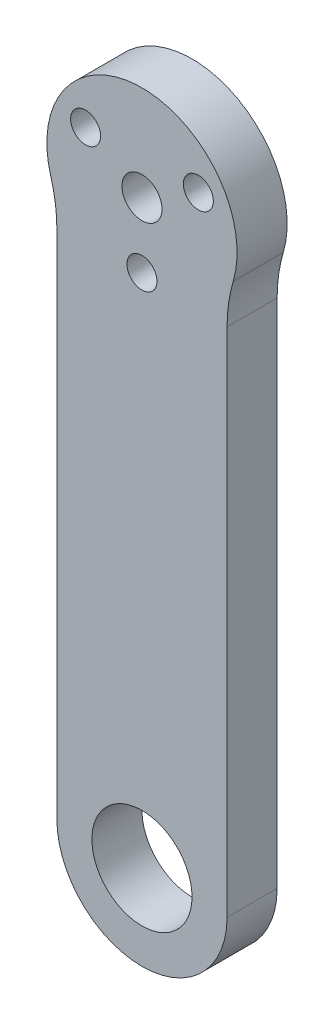
ISO-10303-21;
HEADER;
FILE_DESCRIPTION(('STEP AP214'),'2;1');
FILE_NAME('part.step','',(''),(''),'','','');
FILE_SCHEMA(('AUTOMOTIVE_DESIGN { 1 0 10303 214 1 1 1 1 }'));
ENDSEC;
DATA;
#1=APPLICATION_CONTEXT('core data for automotive mechanical design processes');
#2=APPLICATION_PROTOCOL_DEFINITION('international standard','automotive_design',2000,#1);
#3=PRODUCT_CONTEXT('',#1,'mechanical');
#4=PRODUCT('Part','Part','',(#3));
#5=PRODUCT_RELATED_PRODUCT_CATEGORY('part','',(#4));
#6=PRODUCT_DEFINITION_FORMATION('','',#4);
#7=PRODUCT_DEFINITION_CONTEXT('part definition',#1,'design');
#8=PRODUCT_DEFINITION('design','',#6,#7);
#9=PRODUCT_DEFINITION_SHAPE('','',#8);
#10=(LENGTH_UNIT() NAMED_UNIT(*) SI_UNIT(.MILLI.,.METRE.));
#11=(NAMED_UNIT(*) PLANE_ANGLE_UNIT() SI_UNIT($,.RADIAN.));
#12=(NAMED_UNIT(*) SI_UNIT($,.STERADIAN.) SOLID_ANGLE_UNIT());
#13=UNCERTAINTY_MEASURE_WITH_UNIT(LENGTH_MEASURE(1.E-05),#10,'distance_accuracy_value','');
#14=(GEOMETRIC_REPRESENTATION_CONTEXT(3) GLOBAL_UNCERTAINTY_ASSIGNED_CONTEXT((#13)) GLOBAL_UNIT_ASSIGNED_CONTEXT((#10,
#11,#12)) REPRESENTATION_CONTEXT('',''));
#15=CARTESIAN_POINT('',(0.,0.,0.));
#16=DIRECTION('',(0.,0.,1.));
#17=DIRECTION('',(1.,0.,0.));
#18=AXIS2_PLACEMENT_3D('',#15,#16,#17);
#19=CARTESIAN_POINT('',(0.,-58.,5.));
#20=DIRECTION('',(0.,0.,1.));
#21=DIRECTION('',(1.,0.,0.));
#22=AXIS2_PLACEMENT_3D('',#19,#20,#21);
#23=PLANE('',#22);
#24=CARTESIAN_POINT('',(0.,0.,5.));
#25=DIRECTION('',(0.,0.,1.));
#26=DIRECTION('',(1.,0.,0.));
#27=AXIS2_PLACEMENT_3D('',#24,#25,#26);
#28=CIRCLE('',#27,2.);
#29=CARTESIAN_POINT('',(2.,0.,5.));
#30=VERTEX_POINT('',#29);
#31=EDGE_CURVE('E164',#30,#30,#28,.T.);
#32=ORIENTED_EDGE('',*,*,#31,.F.);
#33=EDGE_LOOP('',(#32));
#34=FACE_BOUND('',#33,.T.);
#35=CARTESIAN_POINT('',(0.,-58.,5.));
#36=DIRECTION('',(0.,0.,1.));
#37=DIRECTION('',(1.,0.,0.));
#38=AXIS2_PLACEMENT_3D('',#35,#36,#37);
#39=CIRCLE('',#38,5.00000000000001);
#40=CARTESIAN_POINT('',(5.00000000000002,-58.,5.));
#41=VERTEX_POINT('',#40);
#42=EDGE_CURVE('E152',#41,#41,#39,.T.);
#43=ORIENTED_EDGE('',*,*,#42,.F.);
#44=EDGE_LOOP('',(#43));
#45=FACE_BOUND('',#44,.T.);
#46=CARTESIAN_POINT('',(0.,-58.,5.));
#47=DIRECTION('',(0.,0.,1.));
#48=DIRECTION('',(1.,0.,0.));
#49=AXIS2_PLACEMENT_3D('',#46,#47,#48);
#50=CIRCLE('',#49,8.49999999999999);
#51=CARTESIAN_POINT('',(-8.49999999999999,-58.,5.));
#52=VERTEX_POINT('',#51);
#53=CARTESIAN_POINT('',(8.49999999999999,-58.,5.));
#54=VERTEX_POINT('',#53);
#55=EDGE_CURVE('E93',#52,#54,#50,.T.);
#56=ORIENTED_EDGE('',*,*,#55,.T.);
#57=DIRECTION('',(0.,1.,0.));
#58=VECTOR('',#57,1.);
#59=CARTESIAN_POINT('',(8.49999999999999,-58.,5.));
#60=LINE('',#59,#58);
#61=CARTESIAN_POINT('',(8.49999999999999,-6.92820323027554,5.));
#62=VERTEX_POINT('',#61);
#63=EDGE_CURVE('E84',#54,#62,#60,.T.);
#64=ORIENTED_EDGE('',*,*,#63,.T.);
#65=CARTESIAN_POINT('',(23.5,-6.92820323027554,5.));
#66=DIRECTION('',(0.,0.,1.));
#67=DIRECTION('',(1.,0.,0.));
#68=AXIS2_PLACEMENT_3D('',#65,#66,#67);
#69=CIRCLE('',#68,15.);
#70=CARTESIAN_POINT('',(9.11224489795918,-2.68644615051501,5.));
#71=VERTEX_POINT('',#70);
#72=EDGE_CURVE('E11',#62,#71,#69,.F.);
#73=ORIENTED_EDGE('',*,*,#72,.T.);
#74=CARTESIAN_POINT('',(0.,0.,5.));
#75=DIRECTION('',(0.,0.,1.));
#76=DIRECTION('',(1.,0.,0.));
#77=AXIS2_PLACEMENT_3D('',#74,#75,#76);
#78=CIRCLE('',#77,9.5);
#79=CARTESIAN_POINT('',(-9.11224489795918,-2.68644615051501,5.));
#80=VERTEX_POINT('',#79);
#81=EDGE_CURVE('E92',#71,#80,#78,.T.);
#82=ORIENTED_EDGE('',*,*,#81,.T.);
#83=CARTESIAN_POINT('',(-23.5,-6.92820323027554,5.));
#84=DIRECTION('',(0.,0.,1.));
#85=DIRECTION('',(1.,0.,0.));
#86=AXIS2_PLACEMENT_3D('',#83,#84,#85);
#87=CIRCLE('',#86,15.);
#88=CARTESIAN_POINT('',(-8.49999999999999,-6.92820323027554,5.));
#89=VERTEX_POINT('',#88);
#90=EDGE_CURVE('E123',#80,#89,#87,.F.);
#91=ORIENTED_EDGE('',*,*,#90,.T.);
#92=DIRECTION('',(0.,-1.,0.));
#93=VECTOR('',#92,1.);
#94=CARTESIAN_POINT('',(-8.49999999999999,-58.,5.));
#95=LINE('',#94,#93);
#96=EDGE_CURVE('E98',#89,#52,#95,.T.);
#97=ORIENTED_EDGE('',*,*,#96,.T.);
#98=EDGE_LOOP('',(#56,#64,#73,#82,#91,#97));
#99=FACE_BOUND('',#98,.T.);
#100=CARTESIAN_POINT('',(-5.62916512459885,3.25,5.));
#101=DIRECTION('',(0.,0.,1.));
#102=DIRECTION('',(1.,0.,0.));
#103=AXIS2_PLACEMENT_3D('',#100,#101,#102);
#104=CIRCLE('',#103,1.5);
#105=CARTESIAN_POINT('',(-4.12916512459885,3.25,5.));
#106=VERTEX_POINT('',#105);
#107=EDGE_CURVE('E146',#106,#106,#104,.T.);
#108=ORIENTED_EDGE('',*,*,#107,.F.);
#109=EDGE_LOOP('',(#108));
#110=FACE_BOUND('',#109,.T.);
#111=CARTESIAN_POINT('',(5.62916512459885,3.25,5.));
#112=DIRECTION('',(0.,0.,1.));
#113=DIRECTION('',(1.,0.,0.));
#114=AXIS2_PLACEMENT_3D('',#111,#112,#113);
#115=CIRCLE('',#114,1.5);
#116=CARTESIAN_POINT('',(7.12916512459885,3.25,5.));
#117=VERTEX_POINT('',#116);
#118=EDGE_CURVE('E158',#117,#117,#115,.T.);
#119=ORIENTED_EDGE('',*,*,#118,.F.);
#120=EDGE_LOOP('',(#119));
#121=FACE_BOUND('',#120,.T.);
#122=CARTESIAN_POINT('',(0.,-6.5,5.));
#123=DIRECTION('',(0.,0.,1.));
#124=DIRECTION('',(1.,0.,0.));
#125=AXIS2_PLACEMENT_3D('',#122,#123,#124);
#126=CIRCLE('',#125,1.5);
#127=CARTESIAN_POINT('',(1.5,-6.5,5.));
#128=VERTEX_POINT('',#127);
#129=EDGE_CURVE('E170',#128,#128,#126,.T.);
#130=ORIENTED_EDGE('',*,*,#129,.F.);
#131=EDGE_LOOP('',(#130));
#132=FACE_BOUND('',#131,.T.);
#133=ADVANCED_FACE('F35',(#34,#45,#99,#110,#121,#132),#23,.T.);
#134=CARTESIAN_POINT('',(0.,-58.,0.));
#135=DIRECTION('',(0.,0.,1.));
#136=DIRECTION('',(1.,0.,0.));
#137=AXIS2_PLACEMENT_3D('',#134,#135,#136);
#138=PLANE('',#137);
#139=CARTESIAN_POINT('',(0.,-58.,0.));
#140=DIRECTION('',(0.,0.,1.));
#141=DIRECTION('',(1.,0.,0.));
#142=AXIS2_PLACEMENT_3D('',#139,#140,#141);
#143=CIRCLE('',#142,8.49999999999999);
#144=CARTESIAN_POINT('',(-8.49999999999999,-58.,0.));
#145=VERTEX_POINT('',#144);
#146=CARTESIAN_POINT('',(8.49999999999999,-58.,0.));
#147=VERTEX_POINT('',#146);
#148=EDGE_CURVE('E106',#145,#147,#143,.T.);
#149=ORIENTED_EDGE('',*,*,#148,.F.);
#150=DIRECTION('',(0.,-1.,0.));
#151=VECTOR('',#150,1.);
#152=CARTESIAN_POINT('',(-8.49999999999999,-58.,0.));
#153=LINE('',#152,#151);
#154=CARTESIAN_POINT('',(-8.49999999999999,-6.92820323027554,0.));
#155=VERTEX_POINT('',#154);
#156=EDGE_CURVE('E102',#155,#145,#153,.T.);
#157=ORIENTED_EDGE('',*,*,#156,.F.);
#158=CARTESIAN_POINT('',(-23.5,-6.92820323027554,0.));
#159=DIRECTION('',(0.,0.,1.));
#160=DIRECTION('',(1.,0.,0.));
#161=AXIS2_PLACEMENT_3D('',#158,#159,#160);
#162=CIRCLE('',#161,15.);
#163=CARTESIAN_POINT('',(-9.11224489795918,-2.68644615051501,0.));
#164=VERTEX_POINT('',#163);
#165=EDGE_CURVE('E121',#155,#164,#162,.T.);
#166=ORIENTED_EDGE('',*,*,#165,.T.);
#167=CARTESIAN_POINT('',(0.,0.,0.));
#168=DIRECTION('',(0.,0.,1.));
#169=DIRECTION('',(1.,0.,0.));
#170=AXIS2_PLACEMENT_3D('',#167,#168,#169);
#171=CIRCLE('',#170,9.5);
#172=CARTESIAN_POINT('',(9.11224489795918,-2.68644615051501,0.));
#173=VERTEX_POINT('',#172);
#174=EDGE_CURVE('E138',#173,#164,#171,.T.);
#175=ORIENTED_EDGE('',*,*,#174,.F.);
#176=CARTESIAN_POINT('',(23.5,-6.92820323027554,0.));
#177=DIRECTION('',(0.,0.,1.));
#178=DIRECTION('',(1.,0.,0.));
#179=AXIS2_PLACEMENT_3D('',#176,#177,#178);
#180=CIRCLE('',#179,15.);
#181=CARTESIAN_POINT('',(8.49999999999999,-6.92820323027554,0.));
#182=VERTEX_POINT('',#181);
#183=EDGE_CURVE('E43',#173,#182,#180,.T.);
#184=ORIENTED_EDGE('',*,*,#183,.T.);
#185=DIRECTION('',(0.,1.,0.));
#186=VECTOR('',#185,1.);
#187=CARTESIAN_POINT('',(8.49999999999999,-58.,0.));
#188=LINE('',#187,#186);
#189=EDGE_CURVE('E142',#147,#182,#188,.T.);
#190=ORIENTED_EDGE('',*,*,#189,.F.);
#191=EDGE_LOOP('',(#149,#157,#166,#175,#184,#190));
#192=FACE_BOUND('',#191,.T.);
#193=CARTESIAN_POINT('',(-5.62916512459885,3.25,0.));
#194=DIRECTION('',(0.,0.,1.));
#195=DIRECTION('',(1.,0.,0.));
#196=AXIS2_PLACEMENT_3D('',#193,#194,#195);
#197=CIRCLE('',#196,1.5);
#198=CARTESIAN_POINT('',(-4.12916512459885,3.25,0.));
#199=VERTEX_POINT('',#198);
#200=EDGE_CURVE('E149',#199,#199,#197,.T.);
#201=ORIENTED_EDGE('',*,*,#200,.T.);
#202=EDGE_LOOP('',(#201));
#203=FACE_BOUND('',#202,.T.);
#204=CARTESIAN_POINT('',(0.,-58.,0.));
#205=DIRECTION('',(0.,0.,1.));
#206=DIRECTION('',(1.,0.,0.));
#207=AXIS2_PLACEMENT_3D('',#204,#205,#206);
#208=CIRCLE('',#207,5.00000000000001);
#209=CARTESIAN_POINT('',(5.00000000000002,-58.,0.));
#210=VERTEX_POINT('',#209);
#211=EDGE_CURVE('E155',#210,#210,#208,.T.);
#212=ORIENTED_EDGE('',*,*,#211,.T.);
#213=EDGE_LOOP('',(#212));
#214=FACE_BOUND('',#213,.T.);
#215=CARTESIAN_POINT('',(5.62916512459885,3.25,0.));
#216=DIRECTION('',(0.,0.,1.));
#217=DIRECTION('',(1.,0.,0.));
#218=AXIS2_PLACEMENT_3D('',#215,#216,#217);
#219=CIRCLE('',#218,1.5);
#220=CARTESIAN_POINT('',(7.12916512459885,3.25,0.));
#221=VERTEX_POINT('',#220);
#222=EDGE_CURVE('E161',#221,#221,#219,.T.);
#223=ORIENTED_EDGE('',*,*,#222,.T.);
#224=EDGE_LOOP('',(#223));
#225=FACE_BOUND('',#224,.T.);
#226=CARTESIAN_POINT('',(0.,0.,0.));
#227=DIRECTION('',(0.,0.,1.));
#228=DIRECTION('',(1.,0.,0.));
#229=AXIS2_PLACEMENT_3D('',#226,#227,#228);
#230=CIRCLE('',#229,2.);
#231=CARTESIAN_POINT('',(2.,0.,0.));
#232=VERTEX_POINT('',#231);
#233=EDGE_CURVE('E167',#232,#232,#230,.T.);
#234=ORIENTED_EDGE('',*,*,#233,.T.);
#235=EDGE_LOOP('',(#234));
#236=FACE_BOUND('',#235,.T.);
#237=CARTESIAN_POINT('',(0.,-6.5,0.));
#238=DIRECTION('',(0.,0.,1.));
#239=DIRECTION('',(1.,0.,0.));
#240=AXIS2_PLACEMENT_3D('',#237,#238,#239);
#241=CIRCLE('',#240,1.5);
#242=CARTESIAN_POINT('',(1.5,-6.5,0.));
#243=VERTEX_POINT('',#242);
#244=EDGE_CURVE('E173',#243,#243,#241,.T.);
#245=ORIENTED_EDGE('',*,*,#244,.T.);
#246=EDGE_LOOP('',(#245));
#247=FACE_BOUND('',#246,.T.);
#248=ADVANCED_FACE('F136',(#192,#203,#214,#225,#236,#247),#138,.F.);
#249=CARTESIAN_POINT('',(0.,-58.,5.));
#250=DIRECTION('',(0.,0.,-1.));
#251=DIRECTION('',(-1.,0.,0.));
#252=AXIS2_PLACEMENT_3D('',#249,#250,#251);
#253=CYLINDRICAL_SURFACE('',#252,8.49999999999999);
#254=ORIENTED_EDGE('',*,*,#148,.T.);
#255=DIRECTION('',(0.,0.,-1.));
#256=VECTOR('',#255,1.);
#257=CARTESIAN_POINT('',(8.49999999999999,-58.,5.));
#258=LINE('',#257,#256);
#259=EDGE_CURVE('E88',#54,#147,#258,.T.);
#260=ORIENTED_EDGE('',*,*,#259,.F.);
#261=ORIENTED_EDGE('',*,*,#55,.F.);
#262=DIRECTION('',(0.,0.,-1.));
#263=VECTOR('',#262,1.);
#264=CARTESIAN_POINT('',(-8.49999999999999,-58.,5.));
#265=LINE('',#264,#263);
#266=EDGE_CURVE('E108',#52,#145,#265,.T.);
#267=ORIENTED_EDGE('',*,*,#266,.T.);
#268=EDGE_LOOP('',(#254,#260,#261,#267));
#269=FACE_BOUND('',#268,.T.);
#270=ADVANCED_FACE('F104',(#269),#253,.T.);
#271=CARTESIAN_POINT('',(8.49999999999999,-58.,5.));
#272=DIRECTION('',(-1.,0.,0.));
#273=DIRECTION('',(0.,0.,1.));
#274=AXIS2_PLACEMENT_3D('',#271,#272,#273);
#275=PLANE('',#274);
#276=ORIENTED_EDGE('',*,*,#189,.T.);
#277=DIRECTION('',(0.,0.,1.));
#278=VECTOR('',#277,1.);
#279=CARTESIAN_POINT('',(8.49999999999999,-6.92820323027554,5.));
#280=LINE('',#279,#278);
#281=EDGE_CURVE('E50',#182,#62,#280,.T.);
#282=ORIENTED_EDGE('',*,*,#281,.T.);
#283=ORIENTED_EDGE('',*,*,#63,.F.);
#284=ORIENTED_EDGE('',*,*,#259,.T.);
#285=EDGE_LOOP('',(#276,#282,#283,#284));
#286=FACE_BOUND('',#285,.T.);
#287=ADVANCED_FACE('F86',(#286),#275,.F.);
#288=CARTESIAN_POINT('',(0.,0.,5.));
#289=DIRECTION('',(0.,0.,-1.));
#290=DIRECTION('',(-1.,0.,0.));
#291=AXIS2_PLACEMENT_3D('',#288,#289,#290);
#292=CYLINDRICAL_SURFACE('',#291,9.5);
#293=ORIENTED_EDGE('',*,*,#174,.T.);
#294=DIRECTION('',(0.,0.,-1.));
#295=VECTOR('',#294,1.);
#296=CARTESIAN_POINT('',(-9.11224489795918,-2.68644615051501,5.));
#297=LINE('',#296,#295);
#298=EDGE_CURVE('E118',#164,#80,#297,.F.);
#299=ORIENTED_EDGE('',*,*,#298,.T.);
#300=ORIENTED_EDGE('',*,*,#81,.F.);
#301=DIRECTION('',(0.,0.,-1.));
#302=VECTOR('',#301,1.);
#303=CARTESIAN_POINT('',(9.11224489795918,-2.68644615051501,5.));
#304=LINE('',#303,#302);
#305=EDGE_CURVE('E111',#71,#173,#304,.T.);
#306=ORIENTED_EDGE('',*,*,#305,.T.);
#307=EDGE_LOOP('',(#293,#299,#300,#306));
#308=FACE_BOUND('',#307,.T.);
#309=ADVANCED_FACE('F140',(#308),#292,.T.);
#310=CARTESIAN_POINT('',(-8.49999999999999,-58.,5.));
#311=DIRECTION('',(1.,0.,0.));
#312=DIRECTION('',(0.,0.,-1.));
#313=AXIS2_PLACEMENT_3D('',#310,#311,#312);
#314=PLANE('',#313);
#315=ORIENTED_EDGE('',*,*,#96,.F.);
#316=DIRECTION('',(0.,0.,1.));
#317=VECTOR('',#316,1.);
#318=CARTESIAN_POINT('',(-8.49999999999999,-6.92820323027554,0.));
#319=LINE('',#318,#317);
#320=EDGE_CURVE('E107',#89,#155,#319,.F.);
#321=ORIENTED_EDGE('',*,*,#320,.T.);
#322=ORIENTED_EDGE('',*,*,#156,.T.);
#323=ORIENTED_EDGE('',*,*,#266,.F.);
#324=EDGE_LOOP('',(#315,#321,#322,#323));
#325=FACE_BOUND('',#324,.T.);
#326=ADVANCED_FACE('F131',(#325),#314,.F.);
#327=CARTESIAN_POINT('',(-5.62916512459885,3.25,5.));
#328=DIRECTION('',(0.,0.,-1.));
#329=DIRECTION('',(-1.,0.,0.));
#330=AXIS2_PLACEMENT_3D('',#327,#328,#329);
#331=CYLINDRICAL_SURFACE('',#330,1.5);
#332=ORIENTED_EDGE('',*,*,#107,.T.);
#333=EDGE_LOOP('',(#332));
#334=FACE_BOUND('',#333,.T.);
#335=ORIENTED_EDGE('',*,*,#200,.F.);
#336=EDGE_LOOP('',(#335));
#337=FACE_BOUND('',#336,.T.);
#338=ADVANCED_FACE('F192',(#334,#337),#331,.F.);
#339=CARTESIAN_POINT('',(0.,-58.,5.));
#340=DIRECTION('',(0.,0.,-1.));
#341=DIRECTION('',(-1.,0.,0.));
#342=AXIS2_PLACEMENT_3D('',#339,#340,#341);
#343=CYLINDRICAL_SURFACE('',#342,5.00000000000001);
#344=ORIENTED_EDGE('',*,*,#42,.T.);
#345=EDGE_LOOP('',(#344));
#346=FACE_BOUND('',#345,.T.);
#347=ORIENTED_EDGE('',*,*,#211,.F.);
#348=EDGE_LOOP('',(#347));
#349=FACE_BOUND('',#348,.T.);
#350=ADVANCED_FACE('F218',(#346,#349),#343,.F.);
#351=CARTESIAN_POINT('',(5.62916512459885,3.25,5.));
#352=DIRECTION('',(0.,0.,-1.));
#353=DIRECTION('',(-1.,0.,0.));
#354=AXIS2_PLACEMENT_3D('',#351,#352,#353);
#355=CYLINDRICAL_SURFACE('',#354,1.5);
#356=ORIENTED_EDGE('',*,*,#118,.T.);
#357=EDGE_LOOP('',(#356));
#358=FACE_BOUND('',#357,.T.);
#359=ORIENTED_EDGE('',*,*,#222,.F.);
#360=EDGE_LOOP('',(#359));
#361=FACE_BOUND('',#360,.T.);
#362=ADVANCED_FACE('F213',(#358,#361),#355,.F.);
#363=CARTESIAN_POINT('',(0.,0.,5.));
#364=DIRECTION('',(0.,0.,-1.));
#365=DIRECTION('',(-1.,0.,0.));
#366=AXIS2_PLACEMENT_3D('',#363,#364,#365);
#367=CYLINDRICAL_SURFACE('',#366,2.);
#368=ORIENTED_EDGE('',*,*,#31,.T.);
#369=EDGE_LOOP('',(#368));
#370=FACE_BOUND('',#369,.T.);
#371=ORIENTED_EDGE('',*,*,#233,.F.);
#372=EDGE_LOOP('',(#371));
#373=FACE_BOUND('',#372,.T.);
#374=ADVANCED_FACE('F208',(#370,#373),#367,.F.);
#375=CARTESIAN_POINT('',(0.,-6.5,5.));
#376=DIRECTION('',(0.,0.,-1.));
#377=DIRECTION('',(-1.,0.,0.));
#378=AXIS2_PLACEMENT_3D('',#375,#376,#377);
#379=CYLINDRICAL_SURFACE('',#378,1.5);
#380=ORIENTED_EDGE('',*,*,#129,.T.);
#381=EDGE_LOOP('',(#380));
#382=FACE_BOUND('',#381,.T.);
#383=ORIENTED_EDGE('',*,*,#244,.F.);
#384=EDGE_LOOP('',(#383));
#385=FACE_BOUND('',#384,.T.);
#386=ADVANCED_FACE('F179',(#382,#385),#379,.F.);
#387=CARTESIAN_POINT('',(-23.5,-6.92820323027554,5.));
#388=DIRECTION('',(0.,0.,-1.));
#389=DIRECTION('',(-1.,0.,0.));
#390=AXIS2_PLACEMENT_3D('',#387,#388,#389);
#391=CYLINDRICAL_SURFACE('',#390,15.);
#392=ORIENTED_EDGE('',*,*,#90,.F.);
#393=ORIENTED_EDGE('',*,*,#298,.F.);
#394=ORIENTED_EDGE('',*,*,#165,.F.);
#395=ORIENTED_EDGE('',*,*,#320,.F.);
#396=EDGE_LOOP('',(#392,#393,#394,#395));
#397=FACE_BOUND('',#396,.T.);
#398=ADVANCED_FACE('F134',(#397),#391,.F.);
#399=CARTESIAN_POINT('',(23.5,-6.92820323027554,5.));
#400=DIRECTION('',(0.,0.,-1.));
#401=DIRECTION('',(-1.,0.,0.));
#402=AXIS2_PLACEMENT_3D('',#399,#400,#401);
#403=CYLINDRICAL_SURFACE('',#402,15.);
#404=ORIENTED_EDGE('',*,*,#72,.F.);
#405=ORIENTED_EDGE('',*,*,#281,.F.);
#406=ORIENTED_EDGE('',*,*,#183,.F.);
#407=ORIENTED_EDGE('',*,*,#305,.F.);
#408=EDGE_LOOP('',(#404,#405,#406,#407));
#409=FACE_BOUND('',#408,.T.);
#410=ADVANCED_FACE('F37',(#409),#403,.F.);
#411=CLOSED_SHELL('',(#133,#248,#270,#287,#309,#326,#338,#350,#362,#374,#386,#398,#410));
#412=MANIFOLD_SOLID_BREP('B2',#411);
#413=ADVANCED_BREP_SHAPE_REPRESENTATION('',(#18,#412),#14);
#414=SHAPE_DEFINITION_REPRESENTATION(#9,#413);
ENDSEC;
END-ISO-10303-21;
